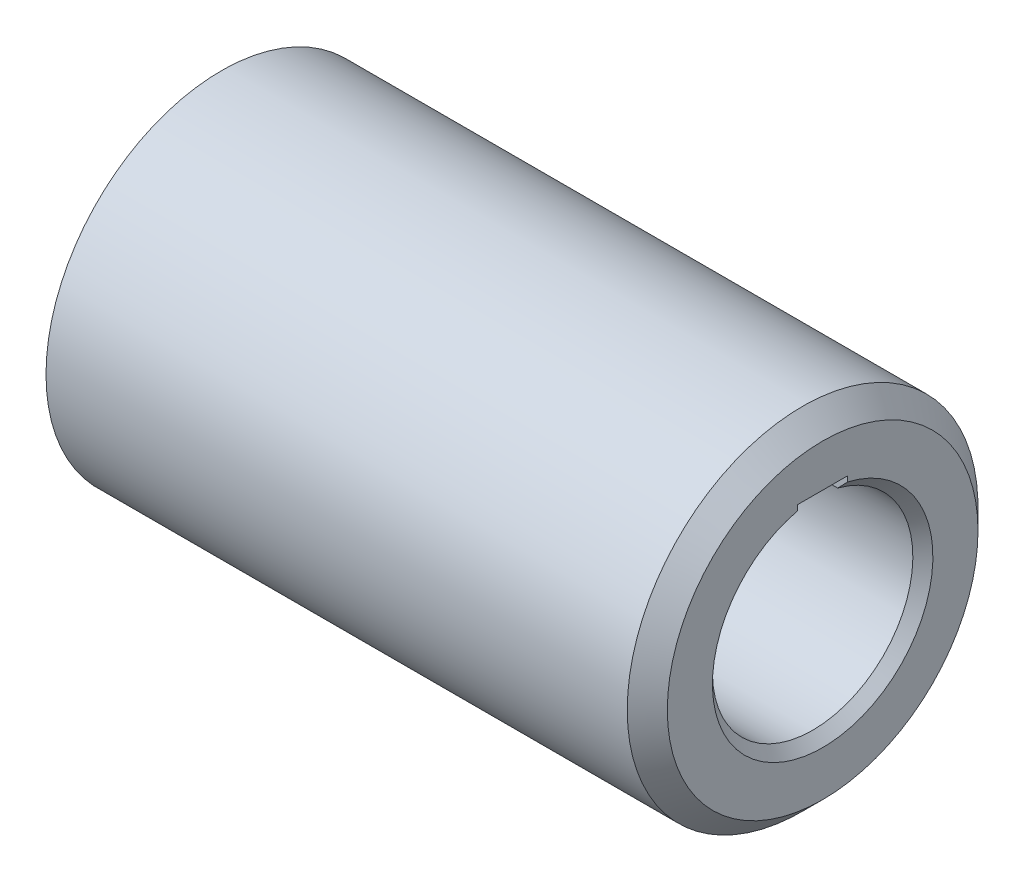
ISO-10303-21;
HEADER;
FILE_DESCRIPTION(('STEP AP214'),'2;1');
FILE_NAME('part.step','',(''),(''),'','','');
FILE_SCHEMA(('AUTOMOTIVE_DESIGN { 1 0 10303 214 1 1 1 1 }'));
ENDSEC;
DATA;
#1=APPLICATION_CONTEXT('core data for automotive mechanical design processes');
#2=APPLICATION_PROTOCOL_DEFINITION('international standard','automotive_design',2000,#1);
#3=PRODUCT_CONTEXT('',#1,'mechanical');
#4=PRODUCT('Part','Part','',(#3));
#5=PRODUCT_RELATED_PRODUCT_CATEGORY('part','',(#4));
#6=PRODUCT_DEFINITION_FORMATION('','',#4);
#7=PRODUCT_DEFINITION_CONTEXT('part definition',#1,'design');
#8=PRODUCT_DEFINITION('design','',#6,#7);
#9=PRODUCT_DEFINITION_SHAPE('','',#8);
#10=(LENGTH_UNIT() NAMED_UNIT(*) SI_UNIT(.MILLI.,.METRE.));
#11=(NAMED_UNIT(*) PLANE_ANGLE_UNIT() SI_UNIT($,.RADIAN.));
#12=(NAMED_UNIT(*) SI_UNIT($,.STERADIAN.) SOLID_ANGLE_UNIT());
#13=UNCERTAINTY_MEASURE_WITH_UNIT(LENGTH_MEASURE(1.E-05),#10,'distance_accuracy_value','');
#14=(GEOMETRIC_REPRESENTATION_CONTEXT(3) GLOBAL_UNCERTAINTY_ASSIGNED_CONTEXT((#13)) GLOBAL_UNIT_ASSIGNED_CONTEXT((#10,
#11,#12)) REPRESENTATION_CONTEXT('',''));
#15=CARTESIAN_POINT('',(0.,0.,0.));
#16=DIRECTION('',(0.,0.,1.));
#17=DIRECTION('',(1.,0.,0.));
#18=AXIS2_PLACEMENT_3D('',#15,#16,#17);
#19=CARTESIAN_POINT('',(38.1,0.,0.));
#20=DIRECTION('',(-1.,0.,0.));
#21=DIRECTION('',(0.,0.,1.));
#22=AXIS2_PLACEMENT_3D('',#19,#20,#21);
#23=CYLINDRICAL_SURFACE('',#22,11.1125);
#24=CARTESIAN_POINT('',(36.83,0.,0.));
#25=DIRECTION('',(1.,0.,0.));
#26=DIRECTION('',(0.,0.,-1.));
#27=AXIS2_PLACEMENT_3D('',#24,#25,#26);
#28=CIRCLE('',#27,11.1125);
#29=CARTESIAN_POINT('',(36.83,0.,11.1125));
#30=VERTEX_POINT('',#29);
#31=EDGE_CURVE('E11',#30,#30,#28,.F.);
#32=CARTESIAN_POINT('',(0.,0.,0.));
#33=DIRECTION('',(1.,0.,0.));
#34=DIRECTION('',(0.,0.,-1.));
#35=AXIS2_PLACEMENT_3D('',#32,#33,#34);
#36=CIRCLE('',#35,11.1125);
#37=CARTESIAN_POINT('',(0.,0.,11.1125));
#38=VERTEX_POINT('',#37);
#39=EDGE_CURVE('E116',#38,#38,#36,.T.);
#40=CARTESIAN_POINT('',(36.83,0.,11.1125));
#41=CARTESIAN_POINT('',(36.4463541666667,0.,11.1125));
#42=CARTESIAN_POINT('',(36.0627083333333,0.,11.1125));
#43=CARTESIAN_POINT('',(35.2954166666667,0.,11.1125));
#44=CARTESIAN_POINT('',(34.9117708333333,0.,11.1125));
#45=CARTESIAN_POINT('',(34.1444791666667,0.,11.1125));
#46=CARTESIAN_POINT('',(33.7608333333333,0.,11.1125));
#47=CARTESIAN_POINT('',(32.9935416666667,0.,11.1125));
#48=CARTESIAN_POINT('',(32.6098958333333,0.,11.1125));
#49=CARTESIAN_POINT('',(31.8426041666667,0.,11.1125));
#50=CARTESIAN_POINT('',(31.4589583333333,0.,11.1125));
#51=CARTESIAN_POINT('',(30.6916666666667,0.,11.1125));
#52=CARTESIAN_POINT('',(30.3080208333333,0.,11.1125));
#53=CARTESIAN_POINT('',(29.5407291666667,0.,11.1125));
#54=CARTESIAN_POINT('',(29.1570833333333,0.,11.1125));
#55=CARTESIAN_POINT('',(28.3897916666667,0.,11.1125));
#56=CARTESIAN_POINT('',(28.0061458333333,0.,11.1125));
#57=CARTESIAN_POINT('',(27.2388541666667,0.,11.1125));
#58=CARTESIAN_POINT('',(26.8552083333333,0.,11.1125));
#59=CARTESIAN_POINT('',(26.0879166666667,0.,11.1125));
#60=CARTESIAN_POINT('',(25.7042708333333,0.,11.1125));
#61=CARTESIAN_POINT('',(24.9369791666667,0.,11.1125));
#62=CARTESIAN_POINT('',(24.5533333333333,0.,11.1125));
#63=CARTESIAN_POINT('',(23.7860416666667,0.,11.1125));
#64=CARTESIAN_POINT('',(23.4023958333333,0.,11.1125));
#65=CARTESIAN_POINT('',(22.6351041666667,0.,11.1125));
#66=CARTESIAN_POINT('',(22.2514583333333,0.,11.1125));
#67=CARTESIAN_POINT('',(21.4841666666667,0.,11.1125));
#68=CARTESIAN_POINT('',(21.1005208333333,0.,11.1125));
#69=CARTESIAN_POINT('',(20.3332291666667,0.,11.1125));
#70=CARTESIAN_POINT('',(19.9495833333333,0.,11.1125));
#71=CARTESIAN_POINT('',(19.1822916666667,0.,11.1125));
#72=CARTESIAN_POINT('',(18.7986458333333,0.,11.1125));
#73=CARTESIAN_POINT('',(18.0313541666667,0.,11.1125));
#74=CARTESIAN_POINT('',(17.6477083333333,0.,11.1125));
#75=CARTESIAN_POINT('',(16.8804166666667,0.,11.1125));
#76=CARTESIAN_POINT('',(16.4967708333333,0.,11.1125));
#77=CARTESIAN_POINT('',(15.7294791666667,0.,11.1125));
#78=CARTESIAN_POINT('',(15.3458333333333,0.,11.1125));
#79=CARTESIAN_POINT('',(14.5785416666667,0.,11.1125));
#80=CARTESIAN_POINT('',(14.1948958333333,0.,11.1125));
#81=CARTESIAN_POINT('',(13.4276041666667,0.,11.1125));
#82=CARTESIAN_POINT('',(13.0439583333333,0.,11.1125));
#83=CARTESIAN_POINT('',(12.2766666666667,0.,11.1125));
#84=CARTESIAN_POINT('',(11.8930208333333,0.,11.1125));
#85=CARTESIAN_POINT('',(11.1257291666667,0.,11.1125));
#86=CARTESIAN_POINT('',(10.7420833333333,0.,11.1125));
#87=CARTESIAN_POINT('',(9.97479166666666,0.,11.1125));
#88=CARTESIAN_POINT('',(9.59114583333333,0.,11.1125));
#89=CARTESIAN_POINT('',(8.82385416666666,0.,11.1125));
#90=CARTESIAN_POINT('',(8.44020833333333,0.,11.1125));
#91=CARTESIAN_POINT('',(7.67291666666666,0.,11.1125));
#92=CARTESIAN_POINT('',(7.28927083333333,0.,11.1125));
#93=CARTESIAN_POINT('',(6.52197916666666,0.,11.1125));
#94=CARTESIAN_POINT('',(6.13833333333333,0.,11.1125));
#95=CARTESIAN_POINT('',(5.37104166666666,0.,11.1125));
#96=CARTESIAN_POINT('',(4.98739583333333,0.,11.1125));
#97=CARTESIAN_POINT('',(4.22010416666667,0.,11.1125));
#98=CARTESIAN_POINT('',(3.83645833333333,0.,11.1125));
#99=CARTESIAN_POINT('',(3.06916666666666,0.,11.1125));
#100=CARTESIAN_POINT('',(2.68552083333333,0.,11.1125));
#101=CARTESIAN_POINT('',(1.91822916666666,0.,11.1125));
#102=CARTESIAN_POINT('',(1.53458333333333,0.,11.1125));
#103=CARTESIAN_POINT('',(0.76729166666666,0.,11.1125));
#104=CARTESIAN_POINT('',(0.38364583333333,0.,11.1125));
#105=CARTESIAN_POINT('',(0.,0.,11.1125));
#106=B_SPLINE_CURVE_WITH_KNOTS('',3,(#40,#41,#42,#43,#44,#45,#46,#47,#48,#49,#50,#51,#52,#53,
#54,#55,#56,#57,#58,#59,#60,#61,#62,#63,#64,#65,#66,#67,#68,#69,#70,#71,#72,#73,#74,#75,#76,#77,
#78,#79,#80,#81,#82,#83,#84,#85,#86,#87,#88,#89,#90,#91,#92,#93,#94,#95,#96,#97,#98,#99,#100,
#101,#102,#103,#104,#105),.UNSPECIFIED.,.F.,.F.,(4,2,2,2,2,2,2,2,2,2,2,2,2,2,2,2,2,2,2,2,2,2,2,
2,2,2,2,2,2,2,2,2,4),(0.,1.1509375,2.301875,3.45281250000001,4.60375,5.7546875,6.90562500000001,
8.0565625,9.20750000000001,10.3584375,11.509375,12.6603125,13.81125,14.9621875,16.113125,
17.2640625,18.415,19.5659375,20.716875,21.8678125,23.01875,24.1696875,25.320625,26.4715625,
27.6225,28.7734375,29.924375,31.0753125,32.22625,33.3771875,34.528125,35.6790625,36.83),.UNSPECIFIED.);
#107=EDGE_CURVE('BSEAM32',#30,#38,#106,.T.);
#108=ORIENTED_EDGE('',*,*,#31,.T.);
#109=ORIENTED_EDGE('',*,*,#39,.T.);
#110=ORIENTED_EDGE('',*,*,#107,.T.);
#111=ORIENTED_EDGE('',*,*,#107,.F.);
#112=EDGE_LOOP('',(#108,#110,#109,#111));
#113=FACE_BOUND('',#112,.T.);
#114=ADVANCED_FACE('F32',(#113),#23,.T.);
#115=CARTESIAN_POINT('',(38.1,0.,0.));
#116=DIRECTION('',(1.,0.,0.));
#117=DIRECTION('',(0.,0.,-1.));
#118=AXIS2_PLACEMENT_3D('',#115,#116,#117);
#119=PLANE('',#118);
#120=CARTESIAN_POINT('',(38.1,0.,0.));
#121=DIRECTION('',(1.,0.,0.));
#122=DIRECTION('',(0.,0.,-1.));
#123=AXIS2_PLACEMENT_3D('',#120,#121,#122);
#124=CIRCLE('',#123,9.84250000000001);
#125=CARTESIAN_POINT('',(38.1,0.,-9.84250000000001));
#126=VERTEX_POINT('',#125);
#127=EDGE_CURVE('E40',#126,#126,#124,.T.);
#128=ORIENTED_EDGE('',*,*,#127,.T.);
#129=EDGE_LOOP('',(#128));
#130=FACE_BOUND('',#129,.T.);
#131=DIRECTION('',(0.,1.,0.));
#132=VECTOR('',#131,1.);
#133=CARTESIAN_POINT('',(38.1,5.55625,-1.5875));
#134=LINE('',#133,#132);
#135=CARTESIAN_POINT('',(38.1,6.80221057818706,-1.5875));
#136=VERTEX_POINT('',#135);
#137=CARTESIAN_POINT('',(38.1,7.14375,-1.5875));
#138=VERTEX_POINT('',#137);
#139=EDGE_CURVE('E94',#136,#138,#134,.T.);
#140=ORIENTED_EDGE('',*,*,#139,.F.);
#141=CARTESIAN_POINT('',(38.1,0.,0.));
#142=DIRECTION('',(1.,0.,0.));
#143=DIRECTION('',(0.,0.,-1.));
#144=AXIS2_PLACEMENT_3D('',#141,#142,#143);
#145=CIRCLE('',#144,6.985);
#146=CARTESIAN_POINT('',(38.1,6.80221057818706,1.5875));
#147=VERTEX_POINT('',#146);
#148=EDGE_CURVE('E47',#136,#147,#145,.F.);
#149=ORIENTED_EDGE('',*,*,#148,.T.);
#150=DIRECTION('',(0.,-1.,0.));
#151=VECTOR('',#150,1.);
#152=CARTESIAN_POINT('',(38.1,5.55625,1.5875));
#153=LINE('',#152,#151);
#154=CARTESIAN_POINT('',(38.1,7.14375,1.5875));
#155=VERTEX_POINT('',#154);
#156=EDGE_CURVE('E89',#155,#147,#153,.T.);
#157=ORIENTED_EDGE('',*,*,#156,.F.);
#158=DIRECTION('',(0.,0.,1.));
#159=VECTOR('',#158,1.);
#160=CARTESIAN_POINT('',(38.1,7.14375,-1.5875));
#161=LINE('',#160,#159);
#162=EDGE_CURVE('E106',#138,#155,#161,.T.);
#163=ORIENTED_EDGE('',*,*,#162,.F.);
#164=EDGE_LOOP('',(#140,#149,#157,#163));
#165=FACE_BOUND('',#164,.T.);
#166=ADVANCED_FACE('F144',(#130,#165),#119,.T.);
#167=CARTESIAN_POINT('',(0.,0.,0.));
#168=DIRECTION('',(1.,0.,0.));
#169=DIRECTION('',(0.,0.,-1.));
#170=AXIS2_PLACEMENT_3D('',#167,#168,#169);
#171=PLANE('',#170);
#172=ORIENTED_EDGE('',*,*,#39,.F.);
#173=EDGE_LOOP('',(#172));
#174=FACE_BOUND('',#173,.T.);
#175=ADVANCED_FACE('F142',(#174),#171,.F.);
#176=CARTESIAN_POINT('',(12.7,0.,0.));
#177=DIRECTION('',(1.,0.,0.));
#178=DIRECTION('',(0.,0.,-1.));
#179=AXIS2_PLACEMENT_3D('',#176,#177,#178);
#180=CYLINDRICAL_SURFACE('',#179,6.35);
#181=DIRECTION('',(1.,0.,0.));
#182=VECTOR('',#181,1.);
#183=CARTESIAN_POINT('',(12.7,6.14836106210428,1.5875));
#184=LINE('',#183,#182);
#185=CARTESIAN_POINT('',(12.7,6.14836106210428,1.5875));
#186=VERTEX_POINT('',#185);
#187=CARTESIAN_POINT('',(37.465,6.14836106210428,1.5875));
#188=VERTEX_POINT('',#187);
#189=EDGE_CURVE('E112',#186,#188,#184,.T.);
#190=ORIENTED_EDGE('',*,*,#189,.T.);
#191=CARTESIAN_POINT('',(37.465,0.,0.));
#192=DIRECTION('',(1.,0.,0.));
#193=DIRECTION('',(0.,0.,-1.));
#194=AXIS2_PLACEMENT_3D('',#191,#192,#193);
#195=CIRCLE('',#194,6.35);
#196=CARTESIAN_POINT('',(37.465,6.14836106210427,-1.5875));
#197=VERTEX_POINT('',#196);
#198=EDGE_CURVE('E119',#188,#197,#195,.T.);
#199=ORIENTED_EDGE('',*,*,#198,.T.);
#200=DIRECTION('',(1.,0.,0.));
#201=VECTOR('',#200,1.);
#202=CARTESIAN_POINT('',(12.7,6.14836106210427,-1.5875));
#203=LINE('',#202,#201);
#204=CARTESIAN_POINT('',(12.7,6.14836106210427,-1.5875));
#205=VERTEX_POINT('',#204);
#206=EDGE_CURVE('E109',#197,#205,#203,.F.);
#207=ORIENTED_EDGE('',*,*,#206,.T.);
#208=CARTESIAN_POINT('',(12.7,0.,0.));
#209=DIRECTION('',(1.,0.,0.));
#210=DIRECTION('',(0.,0.,-1.));
#211=AXIS2_PLACEMENT_3D('',#208,#209,#210);
#212=CIRCLE('',#211,6.35);
#213=EDGE_CURVE('E88',#186,#205,#212,.T.);
#214=ORIENTED_EDGE('',*,*,#213,.F.);
#215=EDGE_LOOP('',(#190,#199,#207,#214));
#216=FACE_BOUND('',#215,.T.);
#217=ADVANCED_FACE('F139',(#216),#180,.F.);
#218=CARTESIAN_POINT('',(12.7,0.,0.));
#219=DIRECTION('',(1.,0.,0.));
#220=DIRECTION('',(0.,0.,-1.));
#221=AXIS2_PLACEMENT_3D('',#218,#219,#220);
#222=PLANE('',#221);
#223=ORIENTED_EDGE('',*,*,#213,.T.);
#224=DIRECTION('',(0.,1.,0.));
#225=VECTOR('',#224,1.);
#226=CARTESIAN_POINT('',(12.7,5.55625,-1.5875));
#227=LINE('',#226,#225);
#228=CARTESIAN_POINT('',(12.7,7.14375,-1.5875));
#229=VERTEX_POINT('',#228);
#230=EDGE_CURVE('E81',#205,#229,#227,.T.);
#231=ORIENTED_EDGE('',*,*,#230,.T.);
#232=DIRECTION('',(0.,0.,1.));
#233=VECTOR('',#232,1.);
#234=CARTESIAN_POINT('',(12.7,7.14375,-1.5875));
#235=LINE('',#234,#233);
#236=CARTESIAN_POINT('',(12.7,7.14375,1.5875));
#237=VERTEX_POINT('',#236);
#238=EDGE_CURVE('E85',#229,#237,#235,.T.);
#239=ORIENTED_EDGE('',*,*,#238,.T.);
#240=DIRECTION('',(0.,-1.,0.));
#241=VECTOR('',#240,1.);
#242=CARTESIAN_POINT('',(12.7,5.55625,1.5875));
#243=LINE('',#242,#241);
#244=EDGE_CURVE('E99',#237,#186,#243,.T.);
#245=ORIENTED_EDGE('',*,*,#244,.T.);
#246=EDGE_LOOP('',(#223,#231,#239,#245));
#247=FACE_BOUND('',#246,.T.);
#248=ADVANCED_FACE('F83',(#247),#222,.T.);
#249=CARTESIAN_POINT('',(12.7,5.55625,1.5875));
#250=DIRECTION('',(0.,0.,1.));
#251=DIRECTION('',(1.,0.,0.));
#252=AXIS2_PLACEMENT_3D('',#249,#250,#251);
#253=PLANE('',#252);
#254=ORIENTED_EDGE('',*,*,#156,.T.);
#255=CARTESIAN_POINT('',(38.1,6.80221057818706,1.5875));
#256=CARTESIAN_POINT('',(37.9940104095989,6.69338741643071,1.5875));
#257=CARTESIAN_POINT('',(37.8880989490251,6.58448837721462,1.5875));
#258=CARTESIAN_POINT('',(37.6764322823508,6.36653853852778,1.5875));
#259=CARTESIAN_POINT('',(37.570677076258,6.25748773904961,1.5875));
#260=CARTESIAN_POINT('',(37.465,6.14836106210428,1.5875));
#261=B_SPLINE_CURVE_WITH_KNOTS('',3,(#255,#256,#257,#258,#259,#260),.UNSPECIFIED.,.F.,.F.,(4,2,
4),(0.,0.455725952747407,0.911451927806097),.UNSPECIFIED.);
#262=EDGE_CURVE('E162',#147,#188,#261,.T.);
#263=ORIENTED_EDGE('',*,*,#262,.T.);
#264=ORIENTED_EDGE('',*,*,#189,.F.);
#265=ORIENTED_EDGE('',*,*,#244,.F.);
#266=DIRECTION('',(1.,0.,0.));
#267=VECTOR('',#266,1.);
#268=CARTESIAN_POINT('',(12.7,7.14375,1.5875));
#269=LINE('',#268,#267);
#270=EDGE_CURVE('E98',#237,#155,#269,.T.);
#271=ORIENTED_EDGE('',*,*,#270,.T.);
#272=EDGE_LOOP('',(#254,#263,#264,#265,#271));
#273=FACE_BOUND('',#272,.T.);
#274=ADVANCED_FACE('F135',(#273),#253,.F.);
#275=CARTESIAN_POINT('',(12.7,5.55625,-1.5875));
#276=DIRECTION('',(0.,0.,-1.));
#277=DIRECTION('',(-1.,0.,0.));
#278=AXIS2_PLACEMENT_3D('',#275,#276,#277);
#279=PLANE('',#278);
#280=ORIENTED_EDGE('',*,*,#206,.F.);
#281=CARTESIAN_POINT('',(37.465,6.14836106210427,-1.5875));
#282=CARTESIAN_POINT('',(37.570677076258,6.25748773904961,-1.5875));
#283=CARTESIAN_POINT('',(37.6764322823508,6.36653853852778,-1.5875));
#284=CARTESIAN_POINT('',(37.8880989490251,6.58448837721461,-1.5875));
#285=CARTESIAN_POINT('',(37.9940104095989,6.69338741643071,-1.5875));
#286=CARTESIAN_POINT('',(38.1,6.80221057818706,-1.5875));
#287=B_SPLINE_CURVE_WITH_KNOTS('',3,(#281,#282,#283,#284,#285,#286),.UNSPECIFIED.,.F.,.F.,(4,2,
4),(0.,0.455725975058691,0.911451927806097),.UNSPECIFIED.);
#288=EDGE_CURVE('E55',#197,#136,#287,.T.);
#289=ORIENTED_EDGE('',*,*,#288,.T.);
#290=ORIENTED_EDGE('',*,*,#139,.T.);
#291=DIRECTION('',(1.,0.,0.));
#292=VECTOR('',#291,1.);
#293=CARTESIAN_POINT('',(12.7,7.14375,-1.5875));
#294=LINE('',#293,#292);
#295=EDGE_CURVE('E92',#229,#138,#294,.T.);
#296=ORIENTED_EDGE('',*,*,#295,.F.);
#297=ORIENTED_EDGE('',*,*,#230,.F.);
#298=EDGE_LOOP('',(#280,#289,#290,#296,#297));
#299=FACE_BOUND('',#298,.T.);
#300=ADVANCED_FACE('F93',(#299),#279,.F.);
#301=CARTESIAN_POINT('',(12.7,7.14375,-1.5875));
#302=DIRECTION('',(0.,1.,0.));
#303=DIRECTION('',(0.,0.,1.));
#304=AXIS2_PLACEMENT_3D('',#301,#302,#303);
#305=PLANE('',#304);
#306=ORIENTED_EDGE('',*,*,#162,.T.);
#307=ORIENTED_EDGE('',*,*,#270,.F.);
#308=ORIENTED_EDGE('',*,*,#238,.F.);
#309=ORIENTED_EDGE('',*,*,#295,.T.);
#310=EDGE_LOOP('',(#306,#307,#308,#309));
#311=FACE_BOUND('',#310,.T.);
#312=ADVANCED_FACE('F101',(#311),#305,.F.);
#313=CARTESIAN_POINT('',(37.465,0.,0.));
#314=DIRECTION('',(1.,0.,0.));
#315=DIRECTION('',(0.,0.,-1.));
#316=AXIS2_PLACEMENT_3D('',#313,#314,#315);
#317=CONICAL_SURFACE('',#316,6.35,0.78539816339745);
#318=ORIENTED_EDGE('',*,*,#262,.F.);
#319=ORIENTED_EDGE('',*,*,#148,.F.);
#320=ORIENTED_EDGE('',*,*,#288,.F.);
#321=ORIENTED_EDGE('',*,*,#198,.F.);
#322=EDGE_LOOP('',(#318,#319,#320,#321));
#323=FACE_BOUND('',#322,.T.);
#324=ADVANCED_FACE('F128',(#323),#317,.F.);
#325=CARTESIAN_POINT('',(38.1,0.,0.));
#326=DIRECTION('',(-1.,0.,0.));
#327=DIRECTION('',(0.,0.,1.));
#328=AXIS2_PLACEMENT_3D('',#325,#326,#327);
#329=CONICAL_SURFACE('',#328,9.84250000000001,0.785398163397447);
#330=ORIENTED_EDGE('',*,*,#31,.F.);
#331=EDGE_LOOP('',(#330));
#332=FACE_BOUND('',#331,.T.);
#333=ORIENTED_EDGE('',*,*,#127,.F.);
#334=EDGE_LOOP('',(#333));
#335=FACE_BOUND('',#334,.T.);
#336=ADVANCED_FACE('F34',(#332,#335),#329,.T.);
#337=CLOSED_SHELL('',(#114,#166,#175,#217,#248,#274,#300,#312,#324,#336));
#338=MANIFOLD_SOLID_BREP('B2',#337);
#339=ADVANCED_BREP_SHAPE_REPRESENTATION('',(#18,#338),#14);
#340=SHAPE_DEFINITION_REPRESENTATION(#9,#339);
ENDSEC;
END-ISO-10303-21;
